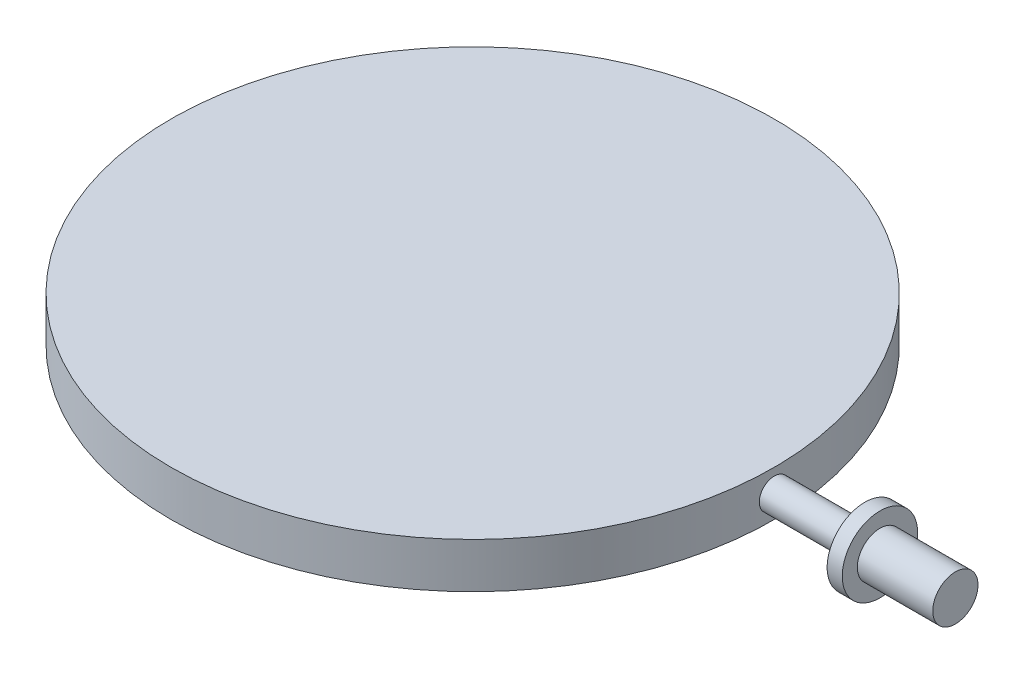
ISO-10303-21;
HEADER;
FILE_DESCRIPTION(('STEP AP214'),'2;1');
FILE_NAME('part.step','',(''),(''),'','','');
FILE_SCHEMA(('AUTOMOTIVE_DESIGN { 1 0 10303 214 1 1 1 1 }'));
ENDSEC;
DATA;
#1=APPLICATION_CONTEXT('core data for automotive mechanical design processes');
#2=APPLICATION_PROTOCOL_DEFINITION('international standard','automotive_design',2000,#1);
#3=PRODUCT_CONTEXT('',#1,'mechanical');
#4=PRODUCT('Part','Part','',(#3));
#5=PRODUCT_RELATED_PRODUCT_CATEGORY('part','',(#4));
#6=PRODUCT_DEFINITION_FORMATION('','',#4);
#7=PRODUCT_DEFINITION_CONTEXT('part definition',#1,'design');
#8=PRODUCT_DEFINITION('design','',#6,#7);
#9=PRODUCT_DEFINITION_SHAPE('','',#8);
#10=(LENGTH_UNIT() NAMED_UNIT(*) SI_UNIT(.MILLI.,.METRE.));
#11=(NAMED_UNIT(*) PLANE_ANGLE_UNIT() SI_UNIT($,.RADIAN.));
#12=(NAMED_UNIT(*) SI_UNIT($,.STERADIAN.) SOLID_ANGLE_UNIT());
#13=UNCERTAINTY_MEASURE_WITH_UNIT(LENGTH_MEASURE(1.E-05),#10,'distance_accuracy_value','');
#14=(GEOMETRIC_REPRESENTATION_CONTEXT(3) GLOBAL_UNCERTAINTY_ASSIGNED_CONTEXT((#13)) GLOBAL_UNIT_ASSIGNED_CONTEXT((#10,
#11,#12)) REPRESENTATION_CONTEXT('',''));
#15=CARTESIAN_POINT('',(0.,0.,0.));
#16=DIRECTION('',(0.,0.,1.));
#17=DIRECTION('',(1.,0.,0.));
#18=AXIS2_PLACEMENT_3D('',#15,#16,#17);
#19=CARTESIAN_POINT('',(130.,7.5,0.));
#20=DIRECTION('',(-1.,0.,0.));
#21=DIRECTION('',(0.,0.,1.));
#22=AXIS2_PLACEMENT_3D('',#19,#20,#21);
#23=CYLINDRICAL_SURFACE('',#22,5.);
#24=CARTESIAN_POINT('',(130.,7.5,0.));
#25=DIRECTION('',(1.,0.,0.));
#26=DIRECTION('',(0.,0.,-1.));
#27=AXIS2_PLACEMENT_3D('',#24,#25,#26);
#28=CIRCLE('',#27,5.);
#29=CARTESIAN_POINT('',(130.,7.5,-5.));
#30=VERTEX_POINT('',#29);
#31=EDGE_CURVE('E47',#30,#30,#28,.T.);
#32=ORIENTED_EDGE('',*,*,#31,.F.);
#33=EDGE_LOOP('',(#32));
#34=FACE_BOUND('',#33,.T.);
#35=CARTESIAN_POINT('',(100.,7.5,0.));
#36=DIRECTION('',(1.,0.,0.));
#37=DIRECTION('',(0.,0.,-1.));
#38=AXIS2_PLACEMENT_3D('',#35,#36,#37);
#39=CIRCLE('',#38,5.);
#40=CARTESIAN_POINT('',(100.,7.5,-5.));
#41=VERTEX_POINT('',#40);
#42=EDGE_CURVE('E43',#41,#41,#39,.T.);
#43=ORIENTED_EDGE('',*,*,#42,.T.);
#44=EDGE_LOOP('',(#43));
#45=FACE_BOUND('',#44,.T.);
#46=ADVANCED_FACE('F40',(#34,#45),#23,.T.);
#47=CARTESIAN_POINT('',(100.,7.5,0.));
#48=DIRECTION('',(1.,0.,0.));
#49=DIRECTION('',(0.,0.,-1.));
#50=AXIS2_PLACEMENT_3D('',#47,#48,#49);
#51=PLANE('',#50);
#52=ORIENTED_EDGE('',*,*,#42,.F.);
#53=EDGE_LOOP('',(#52));
#54=FACE_BOUND('',#53,.T.);
#55=ADVANCED_FACE('F81',(#54),#51,.F.);
#56=CARTESIAN_POINT('',(135.,7.5,0.));
#57=DIRECTION('',(-1.,0.,0.));
#58=DIRECTION('',(0.,0.,1.));
#59=AXIS2_PLACEMENT_3D('',#56,#57,#58);
#60=CYLINDRICAL_SURFACE('',#59,12.5);
#61=CARTESIAN_POINT('',(135.,7.5,0.));
#62=DIRECTION('',(1.,0.,0.));
#63=DIRECTION('',(0.,0.,-1.));
#64=AXIS2_PLACEMENT_3D('',#61,#62,#63);
#65=CIRCLE('',#64,12.5);
#66=CARTESIAN_POINT('',(135.,7.5,-12.5));
#67=VERTEX_POINT('',#66);
#68=EDGE_CURVE('E55',#67,#67,#65,.T.);
#69=ORIENTED_EDGE('',*,*,#68,.F.);
#70=EDGE_LOOP('',(#69));
#71=FACE_BOUND('',#70,.T.);
#72=CARTESIAN_POINT('',(130.,7.5,0.));
#73=DIRECTION('',(1.,0.,0.));
#74=DIRECTION('',(0.,0.,-1.));
#75=AXIS2_PLACEMENT_3D('',#72,#73,#74);
#76=CIRCLE('',#75,12.5);
#77=CARTESIAN_POINT('',(130.,7.5,-12.5));
#78=VERTEX_POINT('',#77);
#79=EDGE_CURVE('E58',#78,#78,#76,.T.);
#80=ORIENTED_EDGE('',*,*,#79,.T.);
#81=EDGE_LOOP('',(#80));
#82=FACE_BOUND('',#81,.T.);
#83=ADVANCED_FACE('F86',(#71,#82),#60,.T.);
#84=CARTESIAN_POINT('',(135.,7.5,0.));
#85=DIRECTION('',(1.,0.,0.));
#86=DIRECTION('',(0.,0.,-1.));
#87=AXIS2_PLACEMENT_3D('',#84,#85,#86);
#88=PLANE('',#87);
#89=CARTESIAN_POINT('',(135.,7.5,0.));
#90=DIRECTION('',(1.,0.,0.));
#91=DIRECTION('',(0.,0.,-1.));
#92=AXIS2_PLACEMENT_3D('',#89,#90,#91);
#93=CIRCLE('',#92,7.5);
#94=CARTESIAN_POINT('',(135.,7.5,-7.5));
#95=VERTEX_POINT('',#94);
#96=EDGE_CURVE('E11',#95,#95,#93,.T.);
#97=ORIENTED_EDGE('',*,*,#96,.F.);
#98=EDGE_LOOP('',(#97));
#99=FACE_BOUND('',#98,.T.);
#100=ORIENTED_EDGE('',*,*,#68,.T.);
#101=EDGE_LOOP('',(#100));
#102=FACE_BOUND('',#101,.T.);
#103=ADVANCED_FACE('F76',(#99,#102),#88,.T.);
#104=CARTESIAN_POINT('',(130.,7.5,0.));
#105=DIRECTION('',(1.,0.,0.));
#106=DIRECTION('',(0.,0.,-1.));
#107=AXIS2_PLACEMENT_3D('',#104,#105,#106);
#108=PLANE('',#107);
#109=ORIENTED_EDGE('',*,*,#31,.T.);
#110=EDGE_LOOP('',(#109));
#111=FACE_BOUND('',#110,.T.);
#112=ORIENTED_EDGE('',*,*,#79,.F.);
#113=EDGE_LOOP('',(#112));
#114=FACE_BOUND('',#113,.T.);
#115=ADVANCED_FACE('F69',(#111,#114),#108,.F.);
#116=CARTESIAN_POINT('',(160.,7.5,0.));
#117=DIRECTION('',(-1.,0.,0.));
#118=DIRECTION('',(0.,0.,1.));
#119=AXIS2_PLACEMENT_3D('',#116,#117,#118);
#120=CYLINDRICAL_SURFACE('',#119,7.5);
#121=CARTESIAN_POINT('',(160.,7.5,0.));
#122=DIRECTION('',(1.,0.,0.));
#123=DIRECTION('',(0.,0.,-1.));
#124=AXIS2_PLACEMENT_3D('',#121,#122,#123);
#125=CIRCLE('',#124,7.5);
#126=CARTESIAN_POINT('',(160.,7.5,-7.5));
#127=VERTEX_POINT('',#126);
#128=EDGE_CURVE('E54',#127,#127,#125,.T.);
#129=ORIENTED_EDGE('',*,*,#128,.F.);
#130=EDGE_LOOP('',(#129));
#131=FACE_BOUND('',#130,.T.);
#132=ORIENTED_EDGE('',*,*,#96,.T.);
#133=EDGE_LOOP('',(#132));
#134=FACE_BOUND('',#133,.T.);
#135=ADVANCED_FACE('F67',(#131,#134),#120,.T.);
#136=CARTESIAN_POINT('',(160.,7.5,0.));
#137=DIRECTION('',(1.,0.,0.));
#138=DIRECTION('',(0.,0.,-1.));
#139=AXIS2_PLACEMENT_3D('',#136,#137,#138);
#140=PLANE('',#139);
#141=ORIENTED_EDGE('',*,*,#128,.T.);
#142=EDGE_LOOP('',(#141));
#143=FACE_BOUND('',#142,.T.);
#144=ADVANCED_FACE('F65',(#143),#140,.T.);
#145=CLOSED_SHELL('',(#46,#55,#83,#103,#115,#135,#144));
#146=MANIFOLD_SOLID_BREP('B2',#145);
#147=CARTESIAN_POINT('',(0.,15.,0.));
#148=DIRECTION('',(0.,-1.,0.));
#149=DIRECTION('',(0.,0.,-1.));
#150=AXIS2_PLACEMENT_3D('',#147,#148,#149);
#151=CYLINDRICAL_SURFACE('',#150,100.);
#152=CARTESIAN_POINT('',(0.,15.,0.));
#153=DIRECTION('',(0.,1.,0.));
#154=DIRECTION('',(0.,0.,1.));
#155=AXIS2_PLACEMENT_3D('',#152,#153,#154);
#156=CIRCLE('',#155,100.);
#157=CARTESIAN_POINT('',(0.,15.,100.));
#158=VERTEX_POINT('',#157);
#159=EDGE_CURVE('E39',#158,#158,#156,.T.);
#160=ORIENTED_EDGE('',*,*,#159,.F.);
#161=EDGE_LOOP('',(#160));
#162=FACE_BOUND('',#161,.T.);
#163=CARTESIAN_POINT('',(0.,0.,0.));
#164=DIRECTION('',(0.,1.,0.));
#165=DIRECTION('',(0.,0.,1.));
#166=AXIS2_PLACEMENT_3D('',#163,#164,#165);
#167=CIRCLE('',#166,100.);
#168=CARTESIAN_POINT('',(0.,0.,100.));
#169=VERTEX_POINT('',#168);
#170=EDGE_CURVE('E143',#169,#169,#167,.T.);
#171=ORIENTED_EDGE('',*,*,#170,.T.);
#172=EDGE_LOOP('',(#171));
#173=FACE_BOUND('',#172,.T.);
#174=ADVANCED_FACE('F140',(#162,#173),#151,.T.);
#175=CARTESIAN_POINT('',(0.,15.,0.));
#176=DIRECTION('',(0.,1.,0.));
#177=DIRECTION('',(0.,0.,1.));
#178=AXIS2_PLACEMENT_3D('',#175,#176,#177);
#179=PLANE('',#178);
#180=ORIENTED_EDGE('',*,*,#159,.T.);
#181=EDGE_LOOP('',(#180));
#182=FACE_BOUND('',#181,.T.);
#183=ADVANCED_FACE('F155',(#182),#179,.T.);
#184=CARTESIAN_POINT('',(0.,0.,0.));
#185=DIRECTION('',(0.,1.,0.));
#186=DIRECTION('',(0.,0.,1.));
#187=AXIS2_PLACEMENT_3D('',#184,#185,#186);
#188=PLANE('',#187);
#189=ORIENTED_EDGE('',*,*,#170,.F.);
#190=EDGE_LOOP('',(#189));
#191=FACE_BOUND('',#190,.T.);
#192=ADVANCED_FACE('F153',(#191),#188,.F.);
#193=CLOSED_SHELL('',(#174,#183,#192));
#194=MANIFOLD_SOLID_BREP('B6',#193);
#195=ADVANCED_BREP_SHAPE_REPRESENTATION('',(#18,#146,#194),#14);
#196=SHAPE_DEFINITION_REPRESENTATION(#9,#195);
ENDSEC;
END-ISO-10303-21;
